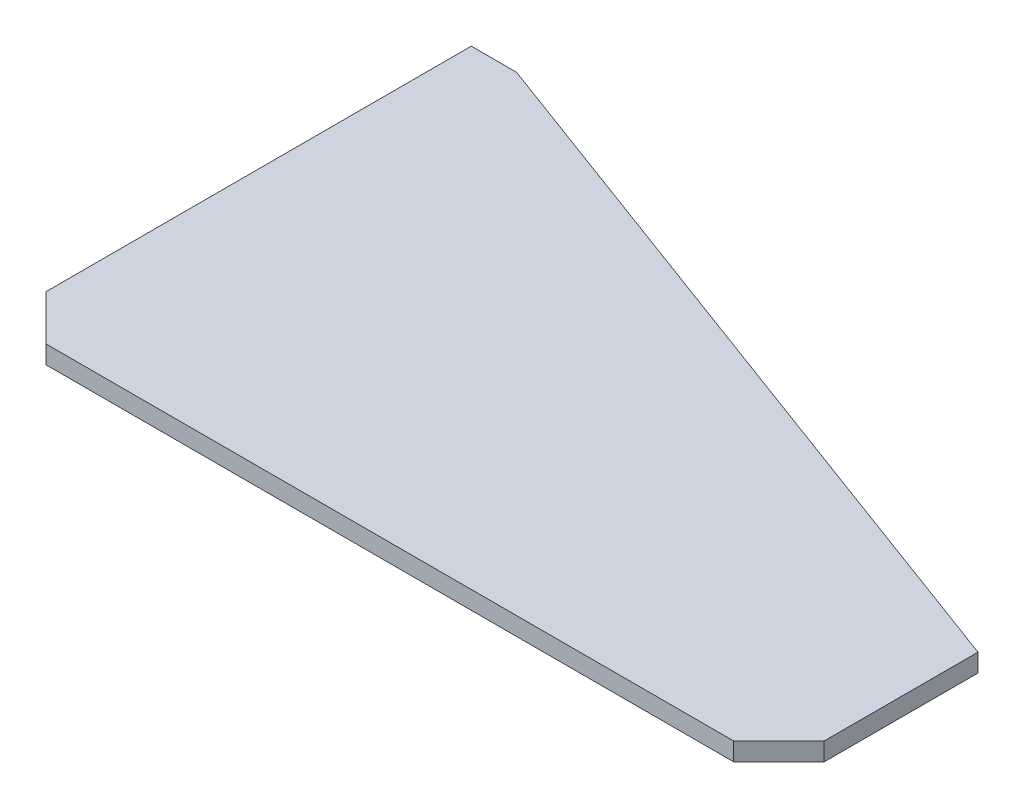
ISO-10303-21;
HEADER;
FILE_DESCRIPTION(('STEP AP214'),'2;1');
FILE_NAME('part.step','',(''),(''),'','','');
FILE_SCHEMA(('AUTOMOTIVE_DESIGN { 1 0 10303 214 1 1 1 1 }'));
ENDSEC;
DATA;
#1=APPLICATION_CONTEXT('core data for automotive mechanical design processes');
#2=APPLICATION_PROTOCOL_DEFINITION('international standard','automotive_design',2000,#1);
#3=PRODUCT_CONTEXT('',#1,'mechanical');
#4=PRODUCT('Part','Part','',(#3));
#5=PRODUCT_RELATED_PRODUCT_CATEGORY('part','',(#4));
#6=PRODUCT_DEFINITION_FORMATION('','',#4);
#7=PRODUCT_DEFINITION_CONTEXT('part definition',#1,'design');
#8=PRODUCT_DEFINITION('design','',#6,#7);
#9=PRODUCT_DEFINITION_SHAPE('','',#8);
#10=(LENGTH_UNIT() NAMED_UNIT(*) SI_UNIT(.MILLI.,.METRE.));
#11=(NAMED_UNIT(*) PLANE_ANGLE_UNIT() SI_UNIT($,.RADIAN.));
#12=(NAMED_UNIT(*) SI_UNIT($,.STERADIAN.) SOLID_ANGLE_UNIT());
#13=UNCERTAINTY_MEASURE_WITH_UNIT(LENGTH_MEASURE(1.E-05),#10,'distance_accuracy_value','');
#14=(GEOMETRIC_REPRESENTATION_CONTEXT(3) GLOBAL_UNCERTAINTY_ASSIGNED_CONTEXT((#13)) GLOBAL_UNIT_ASSIGNED_CONTEXT((#10,
#11,#12)) REPRESENTATION_CONTEXT('',''));
#15=CARTESIAN_POINT('',(0.,0.,0.));
#16=DIRECTION('',(0.,0.,1.));
#17=DIRECTION('',(1.,0.,0.));
#18=AXIS2_PLACEMENT_3D('',#15,#16,#17);
#19=CARTESIAN_POINT('',(0.,2.,-52.));
#20=DIRECTION('',(0.,0.,-1.));
#21=DIRECTION('',(-1.,0.,0.));
#22=AXIS2_PLACEMENT_3D('',#19,#20,#21);
#23=PLANE('',#22);
#24=DIRECTION('',(1.,0.,0.));
#25=VECTOR('',#24,1.);
#26=CARTESIAN_POINT('',(0.,0.,-52.));
#27=LINE('',#26,#25);
#28=CARTESIAN_POINT('',(0.,0.,-52.));
#29=VERTEX_POINT('',#28);
#30=CARTESIAN_POINT('',(5.,0.,-52.));
#31=VERTEX_POINT('',#30);
#32=EDGE_CURVE('E138',#29,#31,#27,.T.);
#33=ORIENTED_EDGE('',*,*,#32,.F.);
#34=DIRECTION('',(0.,-1.,0.));
#35=VECTOR('',#34,1.);
#36=CARTESIAN_POINT('',(0.,2.,-52.));
#37=LINE('',#36,#35);
#38=CARTESIAN_POINT('',(0.,2.,-52.));
#39=VERTEX_POINT('',#38);
#40=EDGE_CURVE('E126',#39,#29,#37,.T.);
#41=ORIENTED_EDGE('',*,*,#40,.F.);
#42=DIRECTION('',(1.,0.,0.));
#43=VECTOR('',#42,1.);
#44=CARTESIAN_POINT('',(0.,2.,-52.));
#45=LINE('',#44,#43);
#46=CARTESIAN_POINT('',(5.,2.,-52.));
#47=VERTEX_POINT('',#46);
#48=EDGE_CURVE('E122',#39,#47,#45,.T.);
#49=ORIENTED_EDGE('',*,*,#48,.T.);
#50=DIRECTION('',(0.,-1.,0.));
#51=VECTOR('',#50,1.);
#52=CARTESIAN_POINT('',(5.,2.,-52.));
#53=LINE('',#52,#51);
#54=EDGE_CURVE('E104',#47,#31,#53,.T.);
#55=ORIENTED_EDGE('',*,*,#54,.T.);
#56=EDGE_LOOP('',(#33,#41,#49,#55));
#57=FACE_BOUND('',#56,.T.);
#58=ADVANCED_FACE('F43',(#57),#23,.T.);
#59=CARTESIAN_POINT('',(0.,2.,0.));
#60=DIRECTION('',(-1.,0.,0.));
#61=DIRECTION('',(0.,0.,1.));
#62=AXIS2_PLACEMENT_3D('',#59,#60,#61);
#63=PLANE('',#62);
#64=DIRECTION('',(0.,0.,-1.));
#65=VECTOR('',#64,1.);
#66=CARTESIAN_POINT('',(0.,0.,0.));
#67=LINE('',#66,#65);
#68=CARTESIAN_POINT('',(0.,0.,-5.00000000000003));
#69=VERTEX_POINT('',#68);
#70=EDGE_CURVE('E127',#69,#29,#67,.T.);
#71=ORIENTED_EDGE('',*,*,#70,.F.);
#72=DIRECTION('',(0.,1.,0.));
#73=VECTOR('',#72,1.);
#74=CARTESIAN_POINT('',(0.,2.,-5.00000000000003));
#75=LINE('',#74,#73);
#76=CARTESIAN_POINT('',(0.,2.,-5.00000000000003));
#77=VERTEX_POINT('',#76);
#78=EDGE_CURVE('E11',#69,#77,#75,.T.);
#79=ORIENTED_EDGE('',*,*,#78,.T.);
#80=DIRECTION('',(0.,0.,-1.));
#81=VECTOR('',#80,1.);
#82=CARTESIAN_POINT('',(0.,2.,0.));
#83=LINE('',#82,#81);
#84=EDGE_CURVE('E116',#77,#39,#83,.T.);
#85=ORIENTED_EDGE('',*,*,#84,.T.);
#86=ORIENTED_EDGE('',*,*,#40,.T.);
#87=EDGE_LOOP('',(#71,#79,#85,#86));
#88=FACE_BOUND('',#87,.T.);
#89=ADVANCED_FACE('F175',(#88),#63,.T.);
#90=CARTESIAN_POINT('',(0.,2.,0.));
#91=DIRECTION('',(0.,0.,-1.));
#92=DIRECTION('',(-1.,0.,0.));
#93=AXIS2_PLACEMENT_3D('',#90,#91,#92);
#94=PLANE('',#93);
#95=DIRECTION('',(1.,0.,0.));
#96=VECTOR('',#95,1.);
#97=CARTESIAN_POINT('',(0.,0.,0.));
#98=LINE('',#97,#96);
#99=CARTESIAN_POINT('',(5.,0.,0.));
#100=VERTEX_POINT('',#99);
#101=CARTESIAN_POINT('',(80.9999999999999,0.,0.));
#102=VERTEX_POINT('',#101);
#103=EDGE_CURVE('E134',#100,#102,#98,.T.);
#104=ORIENTED_EDGE('',*,*,#103,.T.);
#105=DIRECTION('',(0.,1.,0.));
#106=VECTOR('',#105,1.);
#107=CARTESIAN_POINT('',(80.9999999999999,2.,0.));
#108=LINE('',#107,#106);
#109=CARTESIAN_POINT('',(80.9999999999999,2.,0.));
#110=VERTEX_POINT('',#109);
#111=EDGE_CURVE('E64',#102,#110,#108,.T.);
#112=ORIENTED_EDGE('',*,*,#111,.T.);
#113=DIRECTION('',(1.,0.,0.));
#114=VECTOR('',#113,1.);
#115=CARTESIAN_POINT('',(0.,2.,0.));
#116=LINE('',#115,#114);
#117=CARTESIAN_POINT('',(5.,2.,0.));
#118=VERTEX_POINT('',#117);
#119=EDGE_CURVE('E132',#118,#110,#116,.T.);
#120=ORIENTED_EDGE('',*,*,#119,.F.);
#121=DIRECTION('',(0.,-1.,0.));
#122=VECTOR('',#121,1.);
#123=CARTESIAN_POINT('',(5.,0.,0.));
#124=LINE('',#123,#122);
#125=EDGE_CURVE('E155',#118,#100,#124,.T.);
#126=ORIENTED_EDGE('',*,*,#125,.T.);
#127=EDGE_LOOP('',(#104,#112,#120,#126));
#128=FACE_BOUND('',#127,.T.);
#129=ADVANCED_FACE('F166',(#128),#94,.F.);
#130=CARTESIAN_POINT('',(86.,2.,0.));
#131=DIRECTION('',(-1.,0.,0.));
#132=DIRECTION('',(0.,0.,1.));
#133=AXIS2_PLACEMENT_3D('',#130,#131,#132);
#134=PLANE('',#133);
#135=DIRECTION('',(0.,0.,-1.));
#136=VECTOR('',#135,1.);
#137=CARTESIAN_POINT('',(86.,2.,0.));
#138=LINE('',#137,#136);
#139=CARTESIAN_POINT('',(86.,2.,-5.00000000000001));
#140=VERTEX_POINT('',#139);
#141=CARTESIAN_POINT('',(86.,2.,-22.));
#142=VERTEX_POINT('',#141);
#143=EDGE_CURVE('E124',#140,#142,#138,.T.);
#144=ORIENTED_EDGE('',*,*,#143,.F.);
#145=DIRECTION('',(0.,-1.,0.));
#146=VECTOR('',#145,1.);
#147=CARTESIAN_POINT('',(86.,2.,-5.00000000000001));
#148=LINE('',#147,#146);
#149=CARTESIAN_POINT('',(86.,0.,-5.00000000000001));
#150=VERTEX_POINT('',#149);
#151=EDGE_CURVE('E143',#140,#150,#148,.T.);
#152=ORIENTED_EDGE('',*,*,#151,.T.);
#153=DIRECTION('',(0.,0.,-1.));
#154=VECTOR('',#153,1.);
#155=CARTESIAN_POINT('',(86.,0.,0.));
#156=LINE('',#155,#154);
#157=CARTESIAN_POINT('',(86.,0.,-22.));
#158=VERTEX_POINT('',#157);
#159=EDGE_CURVE('E142',#150,#158,#156,.T.);
#160=ORIENTED_EDGE('',*,*,#159,.T.);
#161=DIRECTION('',(0.,-1.,0.));
#162=VECTOR('',#161,1.);
#163=CARTESIAN_POINT('',(86.,2.,-22.));
#164=LINE('',#163,#162);
#165=EDGE_CURVE('E114',#142,#158,#164,.T.);
#166=ORIENTED_EDGE('',*,*,#165,.F.);
#167=EDGE_LOOP('',(#144,#152,#160,#166));
#168=FACE_BOUND('',#167,.T.);
#169=ADVANCED_FACE('F162',(#168),#134,.F.);
#170=CARTESIAN_POINT('',(5.,2.,-52.));
#171=DIRECTION('',(0.347314355823594,0.,-0.937748760723704));
#172=DIRECTION('',(-0.937748760723704,0.,-0.347314355823594));
#173=AXIS2_PLACEMENT_3D('',#170,#171,#172);
#174=PLANE('',#173);
#175=DIRECTION('',(0.937748760723704,0.,0.347314355823594));
#176=VECTOR('',#175,1.);
#177=CARTESIAN_POINT('',(5.,0.,-52.));
#178=LINE('',#177,#176);
#179=EDGE_CURVE('E109',#31,#158,#178,.T.);
#180=ORIENTED_EDGE('',*,*,#179,.F.);
#181=ORIENTED_EDGE('',*,*,#54,.F.);
#182=DIRECTION('',(0.937748760723704,0.,0.347314355823594));
#183=VECTOR('',#182,1.);
#184=CARTESIAN_POINT('',(5.,2.,-52.));
#185=LINE('',#184,#183);
#186=EDGE_CURVE('E108',#47,#142,#185,.T.);
#187=ORIENTED_EDGE('',*,*,#186,.T.);
#188=ORIENTED_EDGE('',*,*,#165,.T.);
#189=EDGE_LOOP('',(#180,#181,#187,#188));
#190=FACE_BOUND('',#189,.T.);
#191=ADVANCED_FACE('F106',(#190),#174,.T.);
#192=CARTESIAN_POINT('',(0.,2.,0.));
#193=DIRECTION('',(0.,1.,0.));
#194=DIRECTION('',(0.,0.,1.));
#195=AXIS2_PLACEMENT_3D('',#192,#193,#194);
#196=PLANE('',#195);
#197=ORIENTED_EDGE('',*,*,#119,.T.);
#198=DIRECTION('',(-0.707106781186549,0.,0.707106781186546));
#199=VECTOR('',#198,1.);
#200=CARTESIAN_POINT('',(40.4999999999998,2.,40.5));
#201=LINE('',#200,#199);
#202=EDGE_CURVE('E55',#110,#140,#201,.F.);
#203=ORIENTED_EDGE('',*,*,#202,.T.);
#204=ORIENTED_EDGE('',*,*,#143,.T.);
#205=ORIENTED_EDGE('',*,*,#186,.F.);
#206=ORIENTED_EDGE('',*,*,#48,.F.);
#207=ORIENTED_EDGE('',*,*,#84,.F.);
#208=DIRECTION('',(0.707106781186546,0.,0.707106781186549));
#209=VECTOR('',#208,1.);
#210=CARTESIAN_POINT('',(2.50000000000002,2.,-2.5));
#211=LINE('',#210,#209);
#212=EDGE_CURVE('E160',#77,#118,#211,.T.);
#213=ORIENTED_EDGE('',*,*,#212,.T.);
#214=EDGE_LOOP('',(#197,#203,#204,#205,#206,#207,#213));
#215=FACE_BOUND('',#214,.T.);
#216=ADVANCED_FACE('F119',(#215),#196,.T.);
#217=CARTESIAN_POINT('',(0.,0.,0.));
#218=DIRECTION('',(0.,1.,0.));
#219=DIRECTION('',(0.,0.,1.));
#220=AXIS2_PLACEMENT_3D('',#217,#218,#219);
#221=PLANE('',#220);
#222=ORIENTED_EDGE('',*,*,#159,.F.);
#223=DIRECTION('',(0.707106781186549,0.,-0.707106781186546));
#224=VECTOR('',#223,1.);
#225=CARTESIAN_POINT('',(86.,0.,-5.));
#226=LINE('',#225,#224);
#227=EDGE_CURVE('E154',#150,#102,#226,.F.);
#228=ORIENTED_EDGE('',*,*,#227,.T.);
#229=ORIENTED_EDGE('',*,*,#103,.F.);
#230=DIRECTION('',(-0.707106781186546,0.,-0.707106781186549));
#231=VECTOR('',#230,1.);
#232=CARTESIAN_POINT('',(5.,0.,0.));
#233=LINE('',#232,#231);
#234=EDGE_CURVE('E147',#100,#69,#233,.T.);
#235=ORIENTED_EDGE('',*,*,#234,.T.);
#236=ORIENTED_EDGE('',*,*,#70,.T.);
#237=ORIENTED_EDGE('',*,*,#32,.T.);
#238=ORIENTED_EDGE('',*,*,#179,.T.);
#239=EDGE_LOOP('',(#222,#228,#229,#235,#236,#237,#238));
#240=FACE_BOUND('',#239,.T.);
#241=ADVANCED_FACE('F170',(#240),#221,.F.);
#242=CARTESIAN_POINT('',(86.,2.,-5.));
#243=DIRECTION('',(-0.707106781186545,0.,-0.707106781186549));
#244=DIRECTION('',(0.,-1.,0.));
#245=AXIS2_PLACEMENT_3D('',#242,#243,#244);
#246=PLANE('',#245);
#247=ORIENTED_EDGE('',*,*,#202,.F.);
#248=ORIENTED_EDGE('',*,*,#111,.F.);
#249=ORIENTED_EDGE('',*,*,#227,.F.);
#250=ORIENTED_EDGE('',*,*,#151,.F.);
#251=EDGE_LOOP('',(#247,#248,#249,#250));
#252=FACE_BOUND('',#251,.T.);
#253=ADVANCED_FACE('F165',(#252),#246,.F.);
#254=CARTESIAN_POINT('',(5.,2.,0.));
#255=DIRECTION('',(-0.707106781186549,0.,0.707106781186545));
#256=DIRECTION('',(0.,1.,0.));
#257=AXIS2_PLACEMENT_3D('',#254,#255,#256);
#258=PLANE('',#257);
#259=ORIENTED_EDGE('',*,*,#212,.F.);
#260=ORIENTED_EDGE('',*,*,#78,.F.);
#261=ORIENTED_EDGE('',*,*,#234,.F.);
#262=ORIENTED_EDGE('',*,*,#125,.F.);
#263=EDGE_LOOP('',(#259,#260,#261,#262));
#264=FACE_BOUND('',#263,.T.);
#265=ADVANCED_FACE('F46',(#264),#258,.T.);
#266=CLOSED_SHELL('',(#58,#89,#129,#169,#191,#216,#241,#253,#265));
#267=MANIFOLD_SOLID_BREP('B2',#266);
#268=ADVANCED_BREP_SHAPE_REPRESENTATION('',(#18,#267),#14);
#269=SHAPE_DEFINITION_REPRESENTATION(#9,#268);
ENDSEC;
END-ISO-10303-21;
